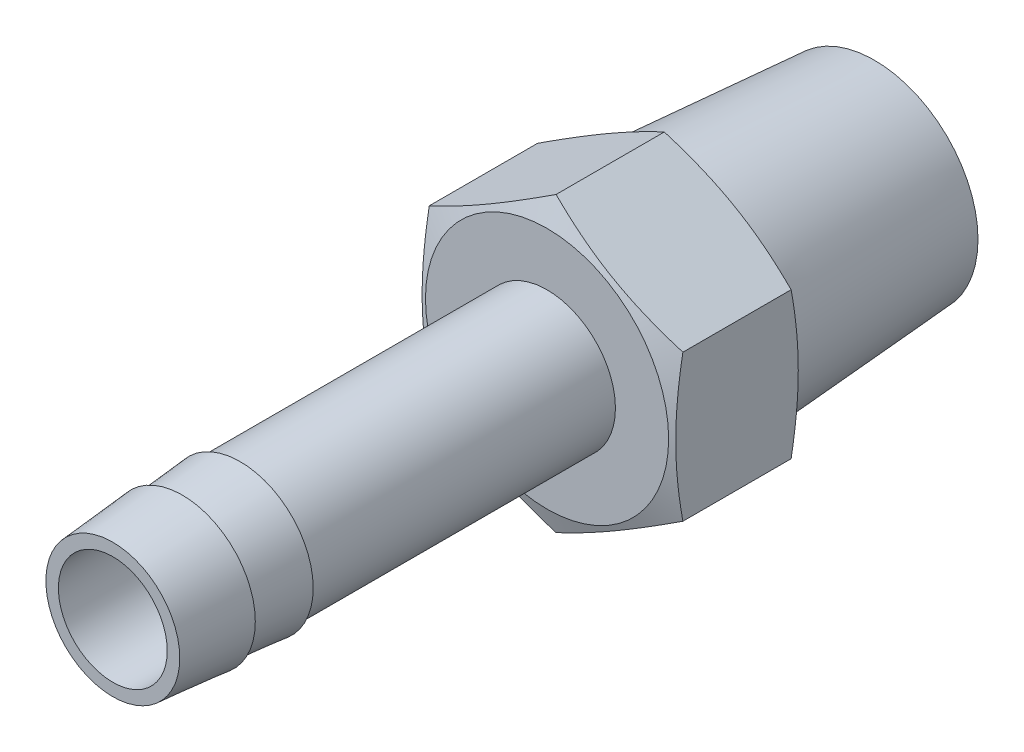
ISO-10303-21;
HEADER;
FILE_DESCRIPTION(('STEP AP214'),'2;1');
FILE_NAME('part.step','',(''),(''),'','','');
FILE_SCHEMA(('AUTOMOTIVE_DESIGN { 1 0 10303 214 1 1 1 1 }'));
ENDSEC;
DATA;
#1=APPLICATION_CONTEXT('core data for automotive mechanical design processes');
#2=APPLICATION_PROTOCOL_DEFINITION('international standard','automotive_design',2000,#1);
#3=PRODUCT_CONTEXT('',#1,'mechanical');
#4=PRODUCT('Part','Part','',(#3));
#5=PRODUCT_RELATED_PRODUCT_CATEGORY('part','',(#4));
#6=PRODUCT_DEFINITION_FORMATION('','',#4);
#7=PRODUCT_DEFINITION_CONTEXT('part definition',#1,'design');
#8=PRODUCT_DEFINITION('design','',#6,#7);
#9=PRODUCT_DEFINITION_SHAPE('','',#8);
#10=(LENGTH_UNIT() NAMED_UNIT(*) SI_UNIT(.MILLI.,.METRE.));
#11=(NAMED_UNIT(*) PLANE_ANGLE_UNIT() SI_UNIT($,.RADIAN.));
#12=(NAMED_UNIT(*) SI_UNIT($,.STERADIAN.) SOLID_ANGLE_UNIT());
#13=UNCERTAINTY_MEASURE_WITH_UNIT(LENGTH_MEASURE(1.E-05),#10,'distance_accuracy_value','');
#14=(GEOMETRIC_REPRESENTATION_CONTEXT(3) GLOBAL_UNCERTAINTY_ASSIGNED_CONTEXT((#13)) GLOBAL_UNIT_ASSIGNED_CONTEXT((#10,
#11,#12)) REPRESENTATION_CONTEXT('',''));
#15=CARTESIAN_POINT('',(0.,0.,0.));
#16=DIRECTION('',(0.,0.,1.));
#17=DIRECTION('',(1.,0.,0.));
#18=AXIS2_PLACEMENT_3D('',#15,#16,#17);
#19=CARTESIAN_POINT('',(0.,2.38759999999999,24.5911444918949));
#20=DIRECTION('',(0.,0.,-1.));
#21=DIRECTION('',(-1.,0.,0.));
#22=AXIS2_PLACEMENT_3D('',#19,#20,#21);
#23=PLANE('',#22);
#24=CARTESIAN_POINT('',(0.,0.,24.5911444918949));
#25=DIRECTION('',(0.,0.,1.));
#26=DIRECTION('',(1.,0.,0.));
#27=AXIS2_PLACEMENT_3D('',#24,#25,#26);
#28=CIRCLE('',#27,2.38759999999999);
#29=CARTESIAN_POINT('',(2.38759999999999,0.,24.5911444918949));
#30=VERTEX_POINT('',#29);
#31=EDGE_CURVE('E200',#30,#30,#28,.T.);
#32=ORIENTED_EDGE('',*,*,#31,.F.);
#33=EDGE_LOOP('',(#32));
#34=FACE_BOUND('',#33,.T.);
#35=CARTESIAN_POINT('',(0.,0.,24.5911444918949));
#36=DIRECTION('',(0.,0.,1.));
#37=DIRECTION('',(1.,0.,0.));
#38=AXIS2_PLACEMENT_3D('',#35,#36,#37);
#39=CIRCLE('',#38,2.93653455357301);
#40=CARTESIAN_POINT('',(2.93653455357301,0.,24.5911444918949));
#41=VERTEX_POINT('',#40);
#42=EDGE_CURVE('E238',#41,#41,#39,.T.);
#43=ORIENTED_EDGE('',*,*,#42,.T.);
#44=EDGE_LOOP('',(#43));
#45=FACE_BOUND('',#44,.T.);
#46=ADVANCED_FACE('F35',(#34,#45),#23,.F.);
#47=CARTESIAN_POINT('',(0.,0.,21.5431444918949));
#48=DIRECTION('',(0.,0.,-1.));
#49=DIRECTION('',(-1.,0.,0.));
#50=AXIS2_PLACEMENT_3D('',#47,#48,#49);
#51=CONICAL_SURFACE('',#50,3.2032,0.0872664625997091);
#52=ORIENTED_EDGE('',*,*,#42,.F.);
#53=EDGE_LOOP('',(#52));
#54=FACE_BOUND('',#53,.T.);
#55=CARTESIAN_POINT('',(0.,0.,21.5431444918949));
#56=DIRECTION('',(0.,0.,1.));
#57=DIRECTION('',(1.,0.,0.));
#58=AXIS2_PLACEMENT_3D('',#55,#56,#57);
#59=CIRCLE('',#58,3.2032);
#60=CARTESIAN_POINT('',(3.2032,0.,21.5431444918949));
#61=VERTEX_POINT('',#60);
#62=EDGE_CURVE('E236',#61,#61,#59,.T.);
#63=ORIENTED_EDGE('',*,*,#62,.T.);
#64=EDGE_LOOP('',(#63));
#65=FACE_BOUND('',#64,.T.);
#66=ADVANCED_FACE('F265',(#54,#65),#51,.T.);
#67=CARTESIAN_POINT('',(0.,0.,21.5238503382204));
#68=DIRECTION('',(0.,0.,1.));
#69=DIRECTION('',(1.,0.,0.));
#70=AXIS2_PLACEMENT_3D('',#67,#68,#69);
#71=CONICAL_SURFACE('',#70,2.98266681436302,1.48352986419519);
#72=ORIENTED_EDGE('',*,*,#62,.F.);
#73=EDGE_LOOP('',(#72));
#74=FACE_BOUND('',#73,.T.);
#75=CARTESIAN_POINT('',(0.,0.,21.5238503382204));
#76=DIRECTION('',(0.,0.,1.));
#77=DIRECTION('',(1.,0.,0.));
#78=AXIS2_PLACEMENT_3D('',#75,#76,#77);
#79=CIRCLE('',#78,2.98266681436302);
#80=CARTESIAN_POINT('',(2.98266681436302,0.,21.5238503382204));
#81=VERTEX_POINT('',#80);
#82=EDGE_CURVE('E233',#81,#81,#79,.T.);
#83=ORIENTED_EDGE('',*,*,#82,.T.);
#84=EDGE_LOOP('',(#83));
#85=FACE_BOUND('',#84,.T.);
#86=ADVANCED_FACE('F270',(#74,#85),#71,.T.);
#87=CARTESIAN_POINT('',(0.,0.,19.0031444918949));
#88=DIRECTION('',(0.,0.,-1.));
#89=DIRECTION('',(-1.,0.,0.));
#90=AXIS2_PLACEMENT_3D('',#87,#88,#89);
#91=CONICAL_SURFACE('',#90,3.2032,0.087266462599709);
#92=ORIENTED_EDGE('',*,*,#82,.F.);
#93=EDGE_LOOP('',(#92));
#94=FACE_BOUND('',#93,.T.);
#95=CARTESIAN_POINT('',(0.,0.,19.0031444918949));
#96=DIRECTION('',(0.,0.,1.));
#97=DIRECTION('',(1.,0.,0.));
#98=AXIS2_PLACEMENT_3D('',#95,#96,#97);
#99=CIRCLE('',#98,3.2032);
#100=CARTESIAN_POINT('',(3.2032,0.,19.0031444918949));
#101=VERTEX_POINT('',#100);
#102=EDGE_CURVE('E230',#101,#101,#99,.T.);
#103=ORIENTED_EDGE('',*,*,#102,.T.);
#104=EDGE_LOOP('',(#103));
#105=FACE_BOUND('',#104,.T.);
#106=ADVANCED_FACE('F344',(#94,#105),#91,.T.);
#107=CARTESIAN_POINT('',(0.,0.,18.9853667954665));
#108=DIRECTION('',(0.,0.,1.));
#109=DIRECTION('',(1.,0.,0.));
#110=AXIS2_PLACEMENT_3D('',#107,#108,#109);
#111=CONICAL_SURFACE('',#110,3.,1.48352986419518);
#112=ORIENTED_EDGE('',*,*,#102,.F.);
#113=EDGE_LOOP('',(#112));
#114=FACE_BOUND('',#113,.T.);
#115=CARTESIAN_POINT('',(0.,0.,18.9853667954665));
#116=DIRECTION('',(0.,0.,1.));
#117=DIRECTION('',(1.,0.,0.));
#118=AXIS2_PLACEMENT_3D('',#115,#116,#117);
#119=CIRCLE('',#118,3.);
#120=CARTESIAN_POINT('',(3.,0.,18.9853667954665));
#121=VERTEX_POINT('',#120);
#122=EDGE_CURVE('E227',#121,#121,#119,.T.);
#123=ORIENTED_EDGE('',*,*,#122,.T.);
#124=EDGE_LOOP('',(#123));
#125=FACE_BOUND('',#124,.T.);
#126=ADVANCED_FACE('F336',(#114,#125),#111,.T.);
#127=CARTESIAN_POINT('',(0.,0.,-2.00199408661353));
#128=DIRECTION('',(0.,0.,1.));
#129=DIRECTION('',(1.,0.,0.));
#130=AXIS2_PLACEMENT_3D('',#127,#128,#129);
#131=CYLINDRICAL_SURFACE('',#130,3.);
#132=ORIENTED_EDGE('',*,*,#122,.F.);
#133=EDGE_LOOP('',(#132));
#134=FACE_BOUND('',#133,.T.);
#135=CARTESIAN_POINT('',(0.,0.,5.54114449189492));
#136=DIRECTION('',(0.,0.,1.));
#137=DIRECTION('',(1.,0.,0.));
#138=AXIS2_PLACEMENT_3D('',#135,#136,#137);
#139=CIRCLE('',#138,3.);
#140=CARTESIAN_POINT('',(3.,0.,5.54114449189492));
#141=VERTEX_POINT('',#140);
#142=EDGE_CURVE('E224',#141,#141,#139,.T.);
#143=ORIENTED_EDGE('',*,*,#142,.T.);
#144=EDGE_LOOP('',(#143));
#145=FACE_BOUND('',#144,.T.);
#146=ADVANCED_FACE('F329',(#134,#145),#131,.T.);
#147=CARTESIAN_POINT('',(0.,3.,5.54114449189492));
#148=DIRECTION('',(0.,0.,-1.));
#149=DIRECTION('',(-1.,0.,0.));
#150=AXIS2_PLACEMENT_3D('',#147,#148,#149);
#151=PLANE('',#150);
#152=ORIENTED_EDGE('',*,*,#142,.F.);
#153=EDGE_LOOP('',(#152));
#154=FACE_BOUND('',#153,.T.);
#155=CARTESIAN_POINT('',(0.,0.,5.54114449189492));
#156=DIRECTION('',(0.,0.,1.));
#157=DIRECTION('',(1.,0.,0.));
#158=AXIS2_PLACEMENT_3D('',#155,#156,#157);
#159=CIRCLE('',#158,5.334);
#160=CARTESIAN_POINT('',(5.334,0.,5.54114449189492));
#161=VERTEX_POINT('',#160);
#162=EDGE_CURVE('E221',#161,#161,#159,.T.);
#163=ORIENTED_EDGE('',*,*,#162,.T.);
#164=EDGE_LOOP('',(#163));
#165=FACE_BOUND('',#164,.T.);
#166=ADVANCED_FACE('F324',(#154,#165),#151,.F.);
#167=CARTESIAN_POINT('',(0.,0.,4.61666009685876));
#168=DIRECTION('',(0.,0.,-1.));
#169=DIRECTION('',(-1.,0.,0.));
#170=AXIS2_PLACEMENT_3D('',#167,#168,#169);
#171=CONICAL_SURFACE('',#170,7.874,1.22173047639603);
#172=CARTESIAN_POINT('',(5.5626,-8.54554870564613,3.7713337094074));
#173=CARTESIAN_POINT('',(5.5626,-8.29339506949219,3.84822885143271));
#174=CARTESIAN_POINT('',(5.5626,-8.04096563886859,3.92423595562298));
#175=CARTESIAN_POINT('',(5.5626,-7.53541465199099,4.07398285346704));
#176=CARTESIAN_POINT('',(5.5626,-7.28229304355041,4.14772247072788));
#177=CARTESIAN_POINT('',(5.5626,-6.77479502650072,4.29256270807403));
#178=CARTESIAN_POINT('',(5.5626,-6.52041717281995,4.36365828288699));
#179=CARTESIAN_POINT('',(5.5626,-6.0107209725132,4.50238934497568));
#180=CARTESIAN_POINT('',(5.5626,-5.75540264258231,4.5700248933586));
#181=CARTESIAN_POINT('',(5.5626,-5.24681855741219,4.70016873630074));
#182=CARTESIAN_POINT('',(5.5626,-4.99356644295143,4.7627300757038));
#183=CARTESIAN_POINT('',(5.5626,-4.48580694775765,4.88259024242452));
#184=CARTESIAN_POINT('',(5.5626,-4.23129954611418,4.93988898176422));
#185=CARTESIAN_POINT('',(5.5626,-3.72096337830154,5.04790244048548));
#186=CARTESIAN_POINT('',(5.5626,-3.46513505382622,5.09861922907826));
#187=CARTESIAN_POINT('',(5.5626,-2.95199123636959,5.19193621515578));
#188=CARTESIAN_POINT('',(5.5626,-2.69467579244848,5.23453667884172));
#189=CARTESIAN_POINT('',(5.5626,-2.20743496300476,5.30568970790488));
#190=CARTESIAN_POINT('',(5.5626,-1.97766257417543,5.33528019843593));
#191=CARTESIAN_POINT('',(5.5626,-1.51713343009414,5.38551216428207));
#192=CARTESIAN_POINT('',(5.5626,-1.28637670358041,5.40615389907907));
#193=CARTESIAN_POINT('',(5.5626,-0.824348395478607,5.43749501074389));
#194=CARTESIAN_POINT('',(5.5626,-0.593077316705621,5.44820168103005));
#195=CARTESIAN_POINT('',(5.5626,-0.130284989650247,5.45912980852409));
#196=CARTESIAN_POINT('',(5.5626,0.101236256624774,5.4593513492499));
#197=CARTESIAN_POINT('',(5.5626,0.565242562726057,5.44927088662767));
#198=CARTESIAN_POINT('',(5.5626,0.797726421509263,5.43891450266108));
#199=CARTESIAN_POINT('',(5.5626,1.26202261723753,5.40815247515708));
#200=CARTESIAN_POINT('',(5.5626,1.49383493771312,5.38774658721969));
#201=CARTESIAN_POINT('',(5.5626,1.95667118162347,5.33784901388525));
#202=CARTESIAN_POINT('',(5.5626,2.18769423444998,5.30834936919579));
#203=CARTESIAN_POINT('',(5.5626,2.64858402276262,5.24147364309617));
#204=CARTESIAN_POINT('',(5.5626,2.87845075352467,5.20409752953392));
#205=CARTESIAN_POINT('',(5.5626,3.35461676896683,5.1195710099851));
#206=CARTESIAN_POINT('',(5.5626,3.6008210712496,5.07189013696224));
#207=CARTESIAN_POINT('',(5.5626,4.09193389098685,4.9702273776282));
#208=CARTESIAN_POINT('',(5.5626,4.33684230087718,4.91624497658275));
#209=CARTESIAN_POINT('',(5.5626,4.82554925856572,4.8031658262339));
#210=CARTESIAN_POINT('',(5.5626,5.06934743272381,4.74406747234213));
#211=CARTESIAN_POINT('',(5.5626,5.55589743714807,4.62175625099128));
#212=CARTESIAN_POINT('',(5.5626,5.79864929457522,4.55854349103088));
#213=CARTESIAN_POINT('',(5.5626,6.28359150607403,4.42870133671378));
#214=CARTESIAN_POINT('',(5.5626,6.52578063157035,4.3620673704488));
#215=CARTESIAN_POINT('',(5.5626,7.00939640962966,4.22608263219788));
#216=CARTESIAN_POINT('',(5.5626,7.25082305061213,4.15673181916116));
#217=CARTESIAN_POINT('',(5.5626,7.97404202926178,3.94540007549008));
#218=CARTESIAN_POINT('',(5.5626,8.45486787468237,3.80011410512942));
#219=CARTESIAN_POINT('',(5.5626,9.4092108519072,3.50522685652038));
#220=CARTESIAN_POINT('',(5.5626,9.88274904392028,3.35569317268865));
#221=CARTESIAN_POINT('',(5.5626,10.8285083809554,3.05244238620377));
#222=CARTESIAN_POINT('',(5.5626,11.3007294564966,2.89872506729009));
#223=CARTESIAN_POINT('',(5.5626,12.2422933940534,2.58887625008539));
#224=CARTESIAN_POINT('',(5.5626,12.7116402311509,2.43275679532578));
#225=CARTESIAN_POINT('',(5.5626,13.6495230159554,2.11823113499853));
#226=CARTESIAN_POINT('',(5.5626,14.1180590296251,1.95982512628801));
#227=CARTESIAN_POINT('',(5.5626,14.5863207253582,1.8006229764812));
#228=B_SPLINE_CURVE_WITH_KNOTS('',3,(#172,#173,#174,#175,#176,#177,#178,#179,#180,#181,#182,
#183,#184,#185,#186,#187,#188,#189,#190,#191,#192,#193,#194,#195,#196,#197,#198,#199,#200,#201,
#202,#203,#204,#205,#206,#207,#208,#209,#210,#211,#212,#213,#214,#215,#216,#217,#218,#219,#220,
#221,#222,#223,#224,#225,#226,#227),.UNSPECIFIED.,.F.,.F.,(4,2,2,2,2,2,2,2,2,2,2,2,2,2,2,2,2,2,
2,2,2,2,2,2,2,2,2,4),(0.,0.79085875995942,1.58177888776594,2.37413795765285,3.16648302892869,
3.94903365056431,4.73159735217397,5.51391443502171,6.29620585482319,6.99106414909324,
7.6859022936102,8.38022994684806,9.07455206950842,9.77246172500104,10.4703883542208,
11.1689275850937,11.8674696674894,12.6197039139892,13.3719996490746,14.1245321981415,
14.8770450933834,15.630591196592,16.3841486900625,17.890970042694,19.380708855008,
20.8705248217333,22.3544112579752,23.8381706945014),.UNSPECIFIED.);
#229=CARTESIAN_POINT('',(5.5626,-3.21156860739422,5.14473096468033));
#230=VERTEX_POINT('',#229);
#231=CARTESIAN_POINT('',(5.5626,3.21156860739422,5.14473096468033));
#232=VERTEX_POINT('',#231);
#233=EDGE_CURVE('E89',#230,#232,#228,.T.);
#234=ORIENTED_EDGE('',*,*,#233,.T.);
#235=CARTESIAN_POINT('',(5.5628,3.21145313734038,5.1446889358845));
#236=CARTESIAN_POINT('',(5.33242403290079,3.34446076395993,5.19311827635646));
#237=CARTESIAN_POINT('',(5.1012883757334,3.47790699784484,5.23717317518359));
#238=CARTESIAN_POINT('',(4.63751416451068,3.74566716353748,5.31468099291214));
#239=CARTESIAN_POINT('',(4.40487457880276,3.87998169097011,5.34812561531736));
#240=CARTESIAN_POINT('',(3.94067432787475,4.14798783080129,5.40222134807434));
#241=CARTESIAN_POINT('',(3.70912426435467,4.28167332230549,5.42299045176448));
#242=CARTESIAN_POINT('',(3.24548264337888,4.54935693698337,5.45084766079256));
#243=CARTESIAN_POINT('',(3.01339132168944,4.68335492403734,5.45794089634166));
#244=CARTESIAN_POINT('',(2.54920867831056,4.9513508981453,5.45794089634166));
#245=CARTESIAN_POINT('',(2.31711735662112,5.08534888519927,5.45084766079256));
#246=CARTESIAN_POINT('',(1.85347573564533,5.35303249987715,5.42299045176448));
#247=CARTESIAN_POINT('',(1.62192567212525,5.48671799138135,5.40222134807434));
#248=CARTESIAN_POINT('',(1.15772542119724,5.75472413121253,5.34812561531736));
#249=CARTESIAN_POINT('',(0.925085835489321,5.88903865864516,5.31468099291214));
#250=CARTESIAN_POINT('',(0.461311624266595,6.1567988243378,5.23717317518359));
#251=CARTESIAN_POINT('',(0.230175967099212,6.29024505822271,5.19311827635646));
#252=CARTESIAN_POINT('',(-0.000199999999997733,6.42325268484226,5.1446889358845));
#253=B_SPLINE_CURVE_WITH_KNOTS('',3,(#235,#236,#237,#238,#239,#240,#241,#242,#243,#244,#245,
#246,#247,#248,#249,#250,#251,#252),.UNSPECIFIED.,.F.,.F.,(4,2,2,2,2,2,2,2,4),(0.,
0.811246819546949,1.62312642293092,2.42732833395453,3.23122850698775,4.03512868002098,
4.83933059104459,5.65121019442856,6.46245701397551),.UNSPECIFIED.);
#254=CARTESIAN_POINT('',(0.,6.42313721478843,5.14473096468033));
#255=VERTEX_POINT('',#254);
#256=EDGE_CURVE('E192',#232,#255,#253,.T.);
#257=ORIENTED_EDGE('',*,*,#256,.T.);
#258=CARTESIAN_POINT('',(0.000199999999999985,6.42325268484226,5.1446889358845));
#259=CARTESIAN_POINT('',(-0.230175967099209,6.29024505822271,5.19311827635646));
#260=CARTESIAN_POINT('',(-0.461311624266594,6.1567988243378,5.23717317518359));
#261=CARTESIAN_POINT('',(-0.925085835489321,5.88903865864516,5.31468099291214));
#262=CARTESIAN_POINT('',(-1.15772542119724,5.75472413121253,5.34812561531735));
#263=CARTESIAN_POINT('',(-1.62192567212525,5.48671799138135,5.40222134807434));
#264=CARTESIAN_POINT('',(-1.85347573564533,5.35303249987716,5.42299045176448));
#265=CARTESIAN_POINT('',(-2.31711735662112,5.08534888519927,5.45084766079256));
#266=CARTESIAN_POINT('',(-2.54920867831056,4.9513508981453,5.45794089634166));
#267=CARTESIAN_POINT('',(-3.01339132168944,4.68335492403734,5.45794089634166));
#268=CARTESIAN_POINT('',(-3.24548264337888,4.54935693698337,5.45084766079256));
#269=CARTESIAN_POINT('',(-3.70912426435467,4.28167332230549,5.42299045176448));
#270=CARTESIAN_POINT('',(-3.94067432787475,4.14798783080129,5.40222134807434));
#271=CARTESIAN_POINT('',(-4.40487457880276,3.87998169097011,5.34812561531735));
#272=CARTESIAN_POINT('',(-4.63751416451068,3.74566716353748,5.31468099291214));
#273=CARTESIAN_POINT('',(-5.10128837573341,3.47790699784483,5.23717317518359));
#274=CARTESIAN_POINT('',(-5.33242403290079,3.34446076395992,5.19311827635646));
#275=CARTESIAN_POINT('',(-5.5628,3.21145313734038,5.1446889358845));
#276=B_SPLINE_CURVE_WITH_KNOTS('',3,(#258,#259,#260,#261,#262,#263,#264,#265,#266,#267,#268,
#269,#270,#271,#272,#273,#274,#275),.UNSPECIFIED.,.F.,.F.,(4,2,2,2,2,2,2,2,4),(0.,
0.81124681954695,1.62312642293092,2.42732833395453,3.23122850698776,4.03512868002098,
4.8393305910446,5.65121019442857,6.46245701397551),.UNSPECIFIED.);
#277=CARTESIAN_POINT('',(-5.5626,3.21156860739421,5.14473096468033));
#278=VERTEX_POINT('',#277);
#279=EDGE_CURVE('E186',#255,#278,#276,.T.);
#280=ORIENTED_EDGE('',*,*,#279,.T.);
#281=CARTESIAN_POINT('',(-5.5626,-8.54554870564613,3.7713337094074));
#282=CARTESIAN_POINT('',(-5.5626,-8.29339506949219,3.84822885143271));
#283=CARTESIAN_POINT('',(-5.5626,-8.04096563886859,3.92423595562298));
#284=CARTESIAN_POINT('',(-5.5626,-7.53541465199099,4.07398285346704));
#285=CARTESIAN_POINT('',(-5.5626,-7.28229304355041,4.14772247072788));
#286=CARTESIAN_POINT('',(-5.5626,-6.77479502650072,4.29256270807403));
#287=CARTESIAN_POINT('',(-5.5626,-6.52041717281995,4.36365828288699));
#288=CARTESIAN_POINT('',(-5.5626,-6.0107209725132,4.50238934497568));
#289=CARTESIAN_POINT('',(-5.5626,-5.7554026425823,4.5700248933586));
#290=CARTESIAN_POINT('',(-5.5626,-5.24681855741218,4.70016873630073));
#291=CARTESIAN_POINT('',(-5.5626,-4.99356644295143,4.7627300757038));
#292=CARTESIAN_POINT('',(-5.5626,-4.48580694775765,4.88259024242452));
#293=CARTESIAN_POINT('',(-5.5626,-4.23129954611418,4.93988898176422));
#294=CARTESIAN_POINT('',(-5.5626,-3.72096337830153,5.04790244048548));
#295=CARTESIAN_POINT('',(-5.5626,-3.46513505382622,5.09861922907826));
#296=CARTESIAN_POINT('',(-5.5626,-2.95199123636958,5.19193621515577));
#297=CARTESIAN_POINT('',(-5.5626,-2.69467579244848,5.23453667884172));
#298=CARTESIAN_POINT('',(-5.5626,-2.20743496300476,5.30568970790488));
#299=CARTESIAN_POINT('',(-5.5626,-1.97766257417543,5.33528019843593));
#300=CARTESIAN_POINT('',(-5.5626,-1.51713343009414,5.38551216428207));
#301=CARTESIAN_POINT('',(-5.5626,-1.28637670358041,5.40615389907907));
#302=CARTESIAN_POINT('',(-5.5626,-0.824348395478605,5.43749501074389));
#303=CARTESIAN_POINT('',(-5.5626,-0.593077316705619,5.44820168103005));
#304=CARTESIAN_POINT('',(-5.5626,-0.130284989650245,5.45912980852409));
#305=CARTESIAN_POINT('',(-5.5626,0.101236256624776,5.4593513492499));
#306=CARTESIAN_POINT('',(-5.5626,0.565242562726061,5.44927088662767));
#307=CARTESIAN_POINT('',(-5.5626,0.797726421509267,5.43891450266108));
#308=CARTESIAN_POINT('',(-5.5626,1.26202261723753,5.40815247515708));
#309=CARTESIAN_POINT('',(-5.5626,1.49383493771312,5.38774658721968));
#310=CARTESIAN_POINT('',(-5.5626,1.95667118162347,5.33784901388525));
#311=CARTESIAN_POINT('',(-5.5626,2.18769423444998,5.30834936919579));
#312=CARTESIAN_POINT('',(-5.5626,2.64858402276262,5.24147364309617));
#313=CARTESIAN_POINT('',(-5.5626,2.87845075352468,5.20409752953392));
#314=CARTESIAN_POINT('',(-5.5626,3.35461676896684,5.1195710099851));
#315=CARTESIAN_POINT('',(-5.5626,3.6008210712496,5.07189013696224));
#316=CARTESIAN_POINT('',(-5.5626,4.09193389098685,4.9702273776282));
#317=CARTESIAN_POINT('',(-5.5626,4.33684230087718,4.91624497658275));
#318=CARTESIAN_POINT('',(-5.5626,4.82554925856573,4.8031658262339));
#319=CARTESIAN_POINT('',(-5.5626,5.06934743272381,4.74406747234213));
#320=CARTESIAN_POINT('',(-5.5626,5.55589743714807,4.62175625099128));
#321=CARTESIAN_POINT('',(-5.5626,5.79864929457522,4.55854349103088));
#322=CARTESIAN_POINT('',(-5.5626,6.28359150607403,4.42870133671378));
#323=CARTESIAN_POINT('',(-5.5626,6.52578063157034,4.3620673704488));
#324=CARTESIAN_POINT('',(-5.5626,7.00939640962966,4.22608263219788));
#325=CARTESIAN_POINT('',(-5.5626,7.25082305061213,4.15673181916116));
#326=CARTESIAN_POINT('',(-5.5626,7.97404202926178,3.94540007549008));
#327=CARTESIAN_POINT('',(-5.5626,8.45486787468237,3.80011410512941));
#328=CARTESIAN_POINT('',(-5.5626,9.4092108519072,3.50522685652038));
#329=CARTESIAN_POINT('',(-5.5626,9.88274904392028,3.35569317268865));
#330=CARTESIAN_POINT('',(-5.5626,10.8285083809554,3.05244238620377));
#331=CARTESIAN_POINT('',(-5.5626,11.3007294564966,2.89872506729009));
#332=CARTESIAN_POINT('',(-5.5626,12.2422933940534,2.58887625008539));
#333=CARTESIAN_POINT('',(-5.5626,12.7116402311509,2.43275679532578));
#334=CARTESIAN_POINT('',(-5.5626,13.6495230159554,2.11823113499853));
#335=CARTESIAN_POINT('',(-5.5626,14.1180590296251,1.95982512628801));
#336=CARTESIAN_POINT('',(-5.5626,14.5863207253582,1.8006229764812));
#337=B_SPLINE_CURVE_WITH_KNOTS('',3,(#281,#282,#283,#284,#285,#286,#287,#288,#289,#290,#291,
#292,#293,#294,#295,#296,#297,#298,#299,#300,#301,#302,#303,#304,#305,#306,#307,#308,#309,#310,
#311,#312,#313,#314,#315,#316,#317,#318,#319,#320,#321,#322,#323,#324,#325,#326,#327,#328,#329,
#330,#331,#332,#333,#334,#335,#336),.UNSPECIFIED.,.F.,.F.,(4,2,2,2,2,2,2,2,2,2,2,2,2,2,2,2,2,2,
2,2,2,2,2,2,2,2,2,4),(0.,0.790858759959419,1.58177888776594,2.37413795765284,3.16648302892869,
3.94903365056431,4.73159735217397,5.51391443502171,6.29620585482319,6.99106414909324,
7.6859022936102,8.38022994684806,9.07455206950842,9.77246172500104,10.4703883542208,
11.1689275850937,11.8674696674894,12.6197039139892,13.3719996490746,14.1245321981415,
14.8770450933834,15.630591196592,16.3841486900625,17.890970042694,19.3807088550079,
20.8705248217333,22.3544112579752,23.8381706945014),.UNSPECIFIED.);
#338=CARTESIAN_POINT('',(-5.5626,-3.21156860739421,5.14473096468033));
#339=VERTEX_POINT('',#338);
#340=EDGE_CURVE('E112',#278,#339,#337,.F.);
#341=ORIENTED_EDGE('',*,*,#340,.T.);
#342=CARTESIAN_POINT('',(-5.5628,-3.21145313734037,5.1446889358845));
#343=CARTESIAN_POINT('',(-5.33242403290079,-3.34446076395992,5.19311827635646));
#344=CARTESIAN_POINT('',(-5.10128837573341,-3.47790699784483,5.23717317518359));
#345=CARTESIAN_POINT('',(-4.63751416451068,-3.74566716353748,5.31468099291214));
#346=CARTESIAN_POINT('',(-4.40487457880276,-3.87998169097011,5.34812561531736));
#347=CARTESIAN_POINT('',(-3.94067432787475,-4.14798783080129,5.40222134807434));
#348=CARTESIAN_POINT('',(-3.70912426435467,-4.28167332230548,5.42299045176448));
#349=CARTESIAN_POINT('',(-3.24548264337888,-4.54935693698337,5.45084766079256));
#350=CARTESIAN_POINT('',(-3.01339132168944,-4.68335492403734,5.45794089634166));
#351=CARTESIAN_POINT('',(-2.54920867831056,-4.95135089814529,5.45794089634166));
#352=CARTESIAN_POINT('',(-2.31711735662112,-5.08534888519927,5.45084766079256));
#353=CARTESIAN_POINT('',(-1.85347573564533,-5.35303249987716,5.42299045176448));
#354=CARTESIAN_POINT('',(-1.62192567212525,-5.48671799138135,5.40222134807434));
#355=CARTESIAN_POINT('',(-1.15772542119724,-5.75472413121253,5.34812561531735));
#356=CARTESIAN_POINT('',(-0.92508583548932,-5.88903865864516,5.31468099291214));
#357=CARTESIAN_POINT('',(-0.461311624266593,-6.1567988243378,5.23717317518359));
#358=CARTESIAN_POINT('',(-0.230175967099208,-6.29024505822271,5.19311827635646));
#359=CARTESIAN_POINT('',(0.000200000000000923,-6.42325268484226,5.1446889358845));
#360=B_SPLINE_CURVE_WITH_KNOTS('',3,(#342,#343,#344,#345,#346,#347,#348,#349,#350,#351,#352,
#353,#354,#355,#356,#357,#358,#359),.UNSPECIFIED.,.F.,.F.,(4,2,2,2,2,2,2,2,4),(0.,
0.81124681954695,1.62312642293092,2.42732833395453,3.23122850698776,4.03512868002099,
4.8393305910446,5.65121019442857,6.46245701397552),.UNSPECIFIED.);
#361=CARTESIAN_POINT('',(0.,-6.42313721478843,5.14473096468033));
#362=VERTEX_POINT('',#361);
#363=EDGE_CURVE('E110',#339,#362,#360,.T.);
#364=ORIENTED_EDGE('',*,*,#363,.T.);
#365=CARTESIAN_POINT('',(-0.000200000000001228,-6.42325268484226,5.1446889358845));
#366=CARTESIAN_POINT('',(0.230175967099208,-6.29024505822271,5.19311827635646));
#367=CARTESIAN_POINT('',(0.461311624266592,-6.1567988243378,5.23717317518359));
#368=CARTESIAN_POINT('',(0.925085835489319,-5.88903865864516,5.31468099291214));
#369=CARTESIAN_POINT('',(1.15772542119724,-5.75472413121253,5.34812561531735));
#370=CARTESIAN_POINT('',(1.62192567212525,-5.48671799138135,5.40222134807434));
#371=CARTESIAN_POINT('',(1.85347573564533,-5.35303249987716,5.42299045176448));
#372=CARTESIAN_POINT('',(2.31711735662111,-5.08534888519927,5.45084766079256));
#373=CARTESIAN_POINT('',(2.54920867831056,-4.9513508981453,5.45794089634166));
#374=CARTESIAN_POINT('',(3.01339132168944,-4.68335492403735,5.45794089634166));
#375=CARTESIAN_POINT('',(3.24548264337888,-4.54935693698337,5.45084766079256));
#376=CARTESIAN_POINT('',(3.70912426435467,-4.28167332230549,5.42299045176448));
#377=CARTESIAN_POINT('',(3.94067432787474,-4.14798783080129,5.40222134807434));
#378=CARTESIAN_POINT('',(4.40487457880276,-3.87998169097011,5.34812561531736));
#379=CARTESIAN_POINT('',(4.63751416451068,-3.74566716353748,5.31468099291214));
#380=CARTESIAN_POINT('',(5.1012883757334,-3.47790699784484,5.23717317518359));
#381=CARTESIAN_POINT('',(5.33242403290079,-3.34446076395993,5.19311827635646));
#382=CARTESIAN_POINT('',(5.5628,-3.21145313734038,5.1446889358845));
#383=B_SPLINE_CURVE_WITH_KNOTS('',3,(#365,#366,#367,#368,#369,#370,#371,#372,#373,#374,#375,
#376,#377,#378,#379,#380,#381,#382),.UNSPECIFIED.,.F.,.F.,(4,2,2,2,2,2,2,2,4),(0.,
0.81124681954695,1.62312642293092,2.42732833395453,3.23122850698776,4.03512868002098,
4.8393305910446,5.65121019442856,6.46245701397551),.UNSPECIFIED.);
#384=EDGE_CURVE('E94',#362,#230,#383,.T.);
#385=ORIENTED_EDGE('',*,*,#384,.T.);
#386=EDGE_LOOP('',(#234,#257,#280,#341,#364,#385));
#387=FACE_BOUND('',#386,.T.);
#388=ORIENTED_EDGE('',*,*,#162,.F.);
#389=EDGE_LOOP('',(#388));
#390=FACE_BOUND('',#389,.T.);
#391=ADVANCED_FACE('F107',(#387,#390),#171,.T.);
#392=CARTESIAN_POINT('',(0.,0.,0.));
#393=DIRECTION('',(0.,0.,1.));
#394=DIRECTION('',(1.,0.,0.));
#395=AXIS2_PLACEMENT_3D('',#392,#393,#394);
#396=CONICAL_SURFACE('',#395,5.334,1.22173047639603);
#397=CARTESIAN_POINT('',(-5.5628,3.21145313734038,0.396455556010419));
#398=CARTESIAN_POINT('',(-5.33242403290079,3.34446076395993,0.348026215538452));
#399=CARTESIAN_POINT('',(-5.10128837573341,3.47790699784484,0.303971316711324));
#400=CARTESIAN_POINT('',(-4.63751416451068,3.74566716353748,0.226463498982773));
#401=CARTESIAN_POINT('',(-4.40487457880276,3.87998169097011,0.19301887657756));
#402=CARTESIAN_POINT('',(-3.94067432787475,4.14798783080129,0.138923143820578));
#403=CARTESIAN_POINT('',(-3.70912426435467,4.28167332230549,0.118154040130432));
#404=CARTESIAN_POINT('',(-3.24548264337888,4.54935693698337,0.0902968311023536));
#405=CARTESIAN_POINT('',(-3.01339132168944,4.68335492403734,0.0832035955532546));
#406=CARTESIAN_POINT('',(-2.54920867831056,4.9513508981453,0.0832035955532547));
#407=CARTESIAN_POINT('',(-2.31711735662112,5.08534888519927,0.0902968311023538));
#408=CARTESIAN_POINT('',(-1.85347573564533,5.35303249987716,0.118154040130432));
#409=CARTESIAN_POINT('',(-1.62192567212525,5.48671799138135,0.138923143820577));
#410=CARTESIAN_POINT('',(-1.15772542119724,5.75472413121253,0.19301887657756));
#411=CARTESIAN_POINT('',(-0.92508583548932,5.88903865864516,0.226463498982773));
#412=CARTESIAN_POINT('',(-0.461311624266593,6.15679882433781,0.303971316711324));
#413=CARTESIAN_POINT('',(-0.230175967099208,6.29024505822272,0.348026215538452));
#414=CARTESIAN_POINT('',(0.000200000000000917,6.42325268484226,0.39645555601042));
#415=B_SPLINE_CURVE_WITH_KNOTS('',3,(#397,#398,#399,#400,#401,#402,#403,#404,#405,#406,#407,
#408,#409,#410,#411,#412,#413,#414),.UNSPECIFIED.,.F.,.F.,(4,2,2,2,2,2,2,2,4),(0.,
0.81124681954695,1.62312642293092,2.42732833395453,3.23122850698776,4.03512868002098,
4.8393305910446,5.65121019442856,6.46245701397551),.UNSPECIFIED.);
#416=CARTESIAN_POINT('',(-5.5626,3.21156860739421,0.396413527214584));
#417=VERTEX_POINT('',#416);
#418=CARTESIAN_POINT('',(0.,6.42313721478843,0.396413527214584));
#419=VERTEX_POINT('',#418);
#420=EDGE_CURVE('E47',#417,#419,#415,.T.);
#421=ORIENTED_EDGE('',*,*,#420,.T.);
#422=CARTESIAN_POINT('',(-0.000199999999999829,6.42325268484226,0.396455556010419));
#423=CARTESIAN_POINT('',(0.23017596709921,6.29024505822271,0.348026215538452));
#424=CARTESIAN_POINT('',(0.461311624266593,6.1567988243378,0.303971316711324));
#425=CARTESIAN_POINT('',(0.92508583548932,5.88903865864516,0.226463498982773));
#426=CARTESIAN_POINT('',(1.15772542119724,5.75472413121253,0.19301887657756));
#427=CARTESIAN_POINT('',(1.62192567212525,5.48671799138135,0.138923143820577));
#428=CARTESIAN_POINT('',(1.85347573564533,5.35303249987716,0.118154040130432));
#429=CARTESIAN_POINT('',(2.31711735662112,5.08534888519927,0.0902968311023536));
#430=CARTESIAN_POINT('',(2.54920867831056,4.9513508981453,0.0832035955532546));
#431=CARTESIAN_POINT('',(3.01339132168944,4.68335492403735,0.0832035955532545));
#432=CARTESIAN_POINT('',(3.24548264337888,4.54935693698337,0.0902968311023535));
#433=CARTESIAN_POINT('',(3.70912426435467,4.28167332230549,0.118154040130431));
#434=CARTESIAN_POINT('',(3.94067432787474,4.14798783080129,0.138923143820577));
#435=CARTESIAN_POINT('',(4.40487457880276,3.87998169097011,0.193018876577559));
#436=CARTESIAN_POINT('',(4.63751416451068,3.74566716353748,0.226463498982772));
#437=CARTESIAN_POINT('',(5.1012883757334,3.47790699784484,0.303971316711323));
#438=CARTESIAN_POINT('',(5.33242403290079,3.34446076395993,0.348026215538451));
#439=CARTESIAN_POINT('',(5.5628,3.21145313734038,0.396455556010418));
#440=B_SPLINE_CURVE_WITH_KNOTS('',3,(#422,#423,#424,#425,#426,#427,#428,#429,#430,#431,#432,
#433,#434,#435,#436,#437,#438,#439),.UNSPECIFIED.,.F.,.F.,(4,2,2,2,2,2,2,2,4),(0.,
0.811246819546949,1.62312642293092,2.42732833395453,3.23122850698775,4.03512868002098,
4.83933059104459,5.65121019442856,6.46245701397551),.UNSPECIFIED.);
#441=CARTESIAN_POINT('',(5.5626,3.21156860739422,0.396413527214583));
#442=VERTEX_POINT('',#441);
#443=EDGE_CURVE('E12',#419,#442,#440,.T.);
#444=ORIENTED_EDGE('',*,*,#443,.T.);
#445=CARTESIAN_POINT('',(5.5626,-8.54554870564614,1.76981078248751));
#446=CARTESIAN_POINT('',(5.5626,-8.29339506949219,1.69291564046221));
#447=CARTESIAN_POINT('',(5.5626,-8.04096563886859,1.61690853627194));
#448=CARTESIAN_POINT('',(5.5626,-7.53541465199099,1.46716163842788));
#449=CARTESIAN_POINT('',(5.5626,-7.28229304355041,1.39342202116704));
#450=CARTESIAN_POINT('',(5.5626,-6.77479502650072,1.24858178382089));
#451=CARTESIAN_POINT('',(5.5626,-6.52041717281995,1.17748620900793));
#452=CARTESIAN_POINT('',(5.5626,-6.0107209725132,1.03875514691924));
#453=CARTESIAN_POINT('',(5.5626,-5.75540264258231,0.971119598536314));
#454=CARTESIAN_POINT('',(5.5626,-5.24681855741219,0.84097575559418));
#455=CARTESIAN_POINT('',(5.5626,-4.99356644295143,0.778414416191112));
#456=CARTESIAN_POINT('',(5.5626,-4.48580694775765,0.658554249470393));
#457=CARTESIAN_POINT('',(5.5626,-4.23129954611418,0.601255510130692));
#458=CARTESIAN_POINT('',(5.5626,-3.72096337830154,0.493242051409434));
#459=CARTESIAN_POINT('',(5.5626,-3.46513505382622,0.442525262816652));
#460=CARTESIAN_POINT('',(5.5626,-2.95199123636959,0.34920827673914));
#461=CARTESIAN_POINT('',(5.5626,-2.69467579244848,0.306607813053197));
#462=CARTESIAN_POINT('',(5.5626,-2.20743496300476,0.235454783990039));
#463=CARTESIAN_POINT('',(5.5626,-1.97766257417543,0.205864293458984));
#464=CARTESIAN_POINT('',(5.5626,-1.51713343009414,0.155632327612842));
#465=CARTESIAN_POINT('',(5.5626,-1.28637670358041,0.134990592815846));
#466=CARTESIAN_POINT('',(5.5626,-0.824348395478609,0.103649481151026));
#467=CARTESIAN_POINT('',(5.5626,-0.593077316705623,0.0929428108648638));
#468=CARTESIAN_POINT('',(5.5626,-0.13028498965025,0.0820146833708237));
#469=CARTESIAN_POINT('',(5.5626,0.101236256624772,0.0817931426450104));
#470=CARTESIAN_POINT('',(5.5626,0.565242562726056,0.0918736052672483));
#471=CARTESIAN_POINT('',(5.5626,0.797726421509262,0.102229989233838));
#472=CARTESIAN_POINT('',(5.5626,1.26202261723753,0.132992016737833));
#473=CARTESIAN_POINT('',(5.5626,1.49383493771312,0.153397904675231));
#474=CARTESIAN_POINT('',(5.5626,1.95667118162347,0.203295478009661));
#475=CARTESIAN_POINT('',(5.5626,2.18769423444997,0.232795122699119));
#476=CARTESIAN_POINT('',(5.5626,2.64858402276261,0.299670848798743));
#477=CARTESIAN_POINT('',(5.5626,2.87845075352467,0.337046962360996));
#478=CARTESIAN_POINT('',(5.5626,3.35461676896683,0.421573481909811));
#479=CARTESIAN_POINT('',(5.5626,3.6008210712496,0.469254354932673));
#480=CARTESIAN_POINT('',(5.5626,4.09193389098685,0.570917114266716));
#481=CARTESIAN_POINT('',(5.5626,4.33684230087718,0.624899515312166));
#482=CARTESIAN_POINT('',(5.5626,4.82554925856573,0.737978665661017));
#483=CARTESIAN_POINT('',(5.5626,5.06934743272382,0.797077019552787));
#484=CARTESIAN_POINT('',(5.5626,5.55589743714808,0.919388240903641));
#485=CARTESIAN_POINT('',(5.5626,5.79864929457522,0.982601000864032));
#486=CARTESIAN_POINT('',(5.5626,6.28359150607403,1.11244315518114));
#487=CARTESIAN_POINT('',(5.5626,6.52578063157035,1.17907712144612));
#488=CARTESIAN_POINT('',(5.5626,7.00939640962967,1.31506185969704));
#489=CARTESIAN_POINT('',(5.5626,7.25082305061214,1.38441267273376));
#490=CARTESIAN_POINT('',(5.5626,7.97404202926179,1.59574441640484));
#491=CARTESIAN_POINT('',(5.5626,8.45486787468238,1.7410303867655));
#492=CARTESIAN_POINT('',(5.5626,9.40921085190721,2.03591763537454));
#493=CARTESIAN_POINT('',(5.5626,9.88274904392029,2.18545131920627));
#494=CARTESIAN_POINT('',(5.5626,10.8285083809554,2.48870210569115));
#495=CARTESIAN_POINT('',(5.5626,11.3007294564966,2.64241942460483));
#496=CARTESIAN_POINT('',(5.5626,12.2422933940534,2.95226824180953));
#497=CARTESIAN_POINT('',(5.5626,12.7116402311509,3.10838769656913));
#498=CARTESIAN_POINT('',(5.5626,13.6495230159554,3.42291335689639));
#499=CARTESIAN_POINT('',(5.5626,14.1180590296251,3.58131936560691));
#500=CARTESIAN_POINT('',(5.5626,14.5863207253582,3.74052151541371));
#501=B_SPLINE_CURVE_WITH_KNOTS('',3,(#445,#446,#447,#448,#449,#450,#451,#452,#453,#454,#455,
#456,#457,#458,#459,#460,#461,#462,#463,#464,#465,#466,#467,#468,#469,#470,#471,#472,#473,#474,
#475,#476,#477,#478,#479,#480,#481,#482,#483,#484,#485,#486,#487,#488,#489,#490,#491,#492,#493,
#494,#495,#496,#497,#498,#499,#500),.UNSPECIFIED.,.F.,.F.,(4,2,2,2,2,2,2,2,2,2,2,2,2,2,2,2,2,2,
2,2,2,2,2,2,2,2,2,4),(0.,0.79085875995942,1.58177888776594,2.37413795765285,3.16648302892869,
3.94903365056431,4.73159735217397,5.51391443502171,6.29620585482319,6.99106414909324,
7.6859022936102,8.38022994684806,9.07455206950842,9.77246172500104,10.4703883542208,
11.1689275850937,11.8674696674894,12.6197039139892,13.3719996490746,14.1245321981415,
14.8770450933834,15.6305911965921,16.3841486900625,17.890970042694,19.380708855008,
20.8705248217333,22.3544112579752,23.8381706945014),.UNSPECIFIED.);
#502=CARTESIAN_POINT('',(5.5626,-3.21156860739423,0.396413527214558));
#503=VERTEX_POINT('',#502);
#504=EDGE_CURVE('E145',#442,#503,#501,.F.);
#505=ORIENTED_EDGE('',*,*,#504,.T.);
#506=CARTESIAN_POINT('',(5.5628,-3.21145313734038,0.396455556010419));
#507=CARTESIAN_POINT('',(5.33242403290079,-3.34446076395993,0.348026215538452));
#508=CARTESIAN_POINT('',(5.1012883757334,-3.47790699784484,0.303971316711324));
#509=CARTESIAN_POINT('',(4.63751416451068,-3.74566716353748,0.226463498982773));
#510=CARTESIAN_POINT('',(4.40487457880276,-3.87998169097011,0.193018876577559));
#511=CARTESIAN_POINT('',(3.94067432787474,-4.14798783080129,0.138923143820577));
#512=CARTESIAN_POINT('',(3.70912426435467,-4.28167332230549,0.118154040130431));
#513=CARTESIAN_POINT('',(3.24548264337888,-4.54935693698337,0.0902968311023535));
#514=CARTESIAN_POINT('',(3.01339132168944,-4.68335492403735,0.0832035955532544));
#515=CARTESIAN_POINT('',(2.54920867831056,-4.9513508981453,0.0832035955532544));
#516=CARTESIAN_POINT('',(2.31711735662111,-5.08534888519927,0.0902968311023535));
#517=CARTESIAN_POINT('',(1.85347573564533,-5.35303249987716,0.118154040130431));
#518=CARTESIAN_POINT('',(1.62192567212525,-5.48671799138135,0.138923143820577));
#519=CARTESIAN_POINT('',(1.15772542119724,-5.75472413121253,0.19301887657756));
#520=CARTESIAN_POINT('',(0.925085835489319,-5.88903865864516,0.226463498982773));
#521=CARTESIAN_POINT('',(0.461311624266593,-6.1567988243378,0.303971316711324));
#522=CARTESIAN_POINT('',(0.230175967099208,-6.29024505822271,0.348026215538452));
#523=CARTESIAN_POINT('',(-0.00020000000000128,-6.42325268484226,0.396455556010419));
#524=B_SPLINE_CURVE_WITH_KNOTS('',3,(#506,#507,#508,#509,#510,#511,#512,#513,#514,#515,#516,
#517,#518,#519,#520,#521,#522,#523),.UNSPECIFIED.,.F.,.F.,(4,2,2,2,2,2,2,2,4),(0.,
0.81124681954695,1.62312642293092,2.42732833395453,3.23122850698776,4.03512868002098,
4.8393305910446,5.65121019442856,6.46245701397551),.UNSPECIFIED.);
#525=CARTESIAN_POINT('',(0.,-6.42313721478843,0.396413527214584));
#526=VERTEX_POINT('',#525);
#527=EDGE_CURVE('E102',#503,#526,#524,.T.);
#528=ORIENTED_EDGE('',*,*,#527,.T.);
#529=CARTESIAN_POINT('',(0.000199999999999008,-6.42325268484226,0.396455556010419));
#530=CARTESIAN_POINT('',(-0.230175967099211,-6.29024505822272,0.348026215538452));
#531=CARTESIAN_POINT('',(-0.461311624266595,-6.1567988243378,0.303971316711324));
#532=CARTESIAN_POINT('',(-0.925085835489322,-5.88903865864516,0.226463498982773));
#533=CARTESIAN_POINT('',(-1.15772542119724,-5.75472413121253,0.193018876577559));
#534=CARTESIAN_POINT('',(-1.62192567212525,-5.48671799138134,0.138923143820577));
#535=CARTESIAN_POINT('',(-1.85347573564533,-5.35303249987715,0.118154040130431));
#536=CARTESIAN_POINT('',(-2.31711735662112,-5.08534888519927,0.0902968311023535));
#537=CARTESIAN_POINT('',(-2.54920867831056,-4.95135089814529,0.0832035955532546));
#538=CARTESIAN_POINT('',(-3.01339132168944,-4.68335492403734,0.0832035955532545));
#539=CARTESIAN_POINT('',(-3.24548264337888,-4.54935693698337,0.0902968311023533));
#540=CARTESIAN_POINT('',(-3.70912426435467,-4.28167332230548,0.118154040130431));
#541=CARTESIAN_POINT('',(-3.94067432787475,-4.14798783080129,0.138923143820577));
#542=CARTESIAN_POINT('',(-4.40487457880276,-3.87998169097011,0.193018876577559));
#543=CARTESIAN_POINT('',(-4.63751416451068,-3.74566716353748,0.226463498982773));
#544=CARTESIAN_POINT('',(-5.10128837573341,-3.47790699784483,0.303971316711324));
#545=CARTESIAN_POINT('',(-5.33242403290079,-3.34446076395992,0.348026215538452));
#546=CARTESIAN_POINT('',(-5.5628,-3.21145313734037,0.396455556010419));
#547=B_SPLINE_CURVE_WITH_KNOTS('',3,(#529,#530,#531,#532,#533,#534,#535,#536,#537,#538,#539,
#540,#541,#542,#543,#544,#545,#546),.UNSPECIFIED.,.F.,.F.,(4,2,2,2,2,2,2,2,4),(0.,
0.81124681954695,1.62312642293092,2.42732833395453,3.23122850698776,4.03512868002098,
4.8393305910446,5.65121019442856,6.46245701397551),.UNSPECIFIED.);
#548=CARTESIAN_POINT('',(-5.5626,-3.21156860739421,0.396413527214583));
#549=VERTEX_POINT('',#548);
#550=EDGE_CURVE('E144',#526,#549,#547,.T.);
#551=ORIENTED_EDGE('',*,*,#550,.T.);
#552=CARTESIAN_POINT('',(-5.5626,-8.54554870564613,1.76981078248751));
#553=CARTESIAN_POINT('',(-5.5626,-8.29339506949219,1.69291564046221));
#554=CARTESIAN_POINT('',(-5.5626,-8.04096563886859,1.61690853627194));
#555=CARTESIAN_POINT('',(-5.5626,-7.53541465199099,1.46716163842788));
#556=CARTESIAN_POINT('',(-5.5626,-7.28229304355041,1.39342202116704));
#557=CARTESIAN_POINT('',(-5.5626,-6.77479502650072,1.24858178382089));
#558=CARTESIAN_POINT('',(-5.5626,-6.52041717281995,1.17748620900793));
#559=CARTESIAN_POINT('',(-5.5626,-6.0107209725132,1.03875514691924));
#560=CARTESIAN_POINT('',(-5.5626,-5.7554026425823,0.971119598536314));
#561=CARTESIAN_POINT('',(-5.5626,-5.24681855741218,0.840975755594181));
#562=CARTESIAN_POINT('',(-5.5626,-4.99356644295143,0.778414416191112));
#563=CARTESIAN_POINT('',(-5.5626,-4.48580694775765,0.658554249470393));
#564=CARTESIAN_POINT('',(-5.5626,-4.23129954611418,0.601255510130692));
#565=CARTESIAN_POINT('',(-5.5626,-3.72096337830153,0.493242051409434));
#566=CARTESIAN_POINT('',(-5.5626,-3.46513505382622,0.442525262816652));
#567=CARTESIAN_POINT('',(-5.5626,-2.95199123636958,0.349208276739141));
#568=CARTESIAN_POINT('',(-5.5626,-2.69467579244848,0.306607813053197));
#569=CARTESIAN_POINT('',(-5.5626,-2.20743496300476,0.235454783990039));
#570=CARTESIAN_POINT('',(-5.5626,-1.97766257417543,0.205864293458985));
#571=CARTESIAN_POINT('',(-5.5626,-1.51713343009414,0.155632327612843));
#572=CARTESIAN_POINT('',(-5.5626,-1.28637670358041,0.134990592815846));
#573=CARTESIAN_POINT('',(-5.5626,-0.824348395478605,0.103649481151026));
#574=CARTESIAN_POINT('',(-5.5626,-0.59307731670562,0.0929428108648641));
#575=CARTESIAN_POINT('',(-5.5626,-0.130284989650246,0.0820146833708242));
#576=CARTESIAN_POINT('',(-5.5626,0.101236256624775,0.0817931426450111));
#577=CARTESIAN_POINT('',(-5.5626,0.565242562726058,0.0918736052672493));
#578=CARTESIAN_POINT('',(-5.5626,0.797726421509263,0.102229989233839));
#579=CARTESIAN_POINT('',(-5.5626,1.26202261723753,0.132992016737834));
#580=CARTESIAN_POINT('',(-5.5626,1.49383493771312,0.153397904675232));
#581=CARTESIAN_POINT('',(-5.5626,1.95667118162347,0.203295478009662));
#582=CARTESIAN_POINT('',(-5.5626,2.18769423444997,0.232795122699121));
#583=CARTESIAN_POINT('',(-5.5626,2.64858402276261,0.299670848798744));
#584=CARTESIAN_POINT('',(-5.5626,2.87845075352467,0.337046962360997));
#585=CARTESIAN_POINT('',(-5.5626,3.35461676896683,0.421573481909811));
#586=CARTESIAN_POINT('',(-5.5626,3.6008210712496,0.469254354932674));
#587=CARTESIAN_POINT('',(-5.5626,4.09193389098685,0.570917114266717));
#588=CARTESIAN_POINT('',(-5.5626,4.33684230087718,0.624899515312166));
#589=CARTESIAN_POINT('',(-5.5626,4.82554925856572,0.737978665661017));
#590=CARTESIAN_POINT('',(-5.5626,5.06934743272381,0.797077019552786));
#591=CARTESIAN_POINT('',(-5.5626,5.55589743714807,0.91938824090364));
#592=CARTESIAN_POINT('',(-5.5626,5.79864929457522,0.982601000864032));
#593=CARTESIAN_POINT('',(-5.5626,6.28359150607403,1.11244315518114));
#594=CARTESIAN_POINT('',(-5.5626,6.52578063157034,1.17907712144612));
#595=CARTESIAN_POINT('',(-5.5626,7.00939640962966,1.31506185969704));
#596=CARTESIAN_POINT('',(-5.5626,7.25082305061213,1.38441267273376));
#597=CARTESIAN_POINT('',(-5.5626,7.97404202926178,1.59574441640483));
#598=CARTESIAN_POINT('',(-5.5626,8.45486787468237,1.7410303867655));
#599=CARTESIAN_POINT('',(-5.5626,9.4092108519072,2.03591763537454));
#600=CARTESIAN_POINT('',(-5.5626,9.88274904392028,2.18545131920627));
#601=CARTESIAN_POINT('',(-5.5626,10.8285083809554,2.48870210569115));
#602=CARTESIAN_POINT('',(-5.5626,11.3007294564966,2.64241942460483));
#603=CARTESIAN_POINT('',(-5.5626,12.2422933940534,2.95226824180953));
#604=CARTESIAN_POINT('',(-5.5626,12.7116402311509,3.10838769656913));
#605=CARTESIAN_POINT('',(-5.5626,13.6495230159554,3.42291335689639));
#606=CARTESIAN_POINT('',(-5.5626,14.1180590296251,3.58131936560691));
#607=CARTESIAN_POINT('',(-5.5626,14.5863207253582,3.74052151541371));
#608=B_SPLINE_CURVE_WITH_KNOTS('',3,(#552,#553,#554,#555,#556,#557,#558,#559,#560,#561,#562,
#563,#564,#565,#566,#567,#568,#569,#570,#571,#572,#573,#574,#575,#576,#577,#578,#579,#580,#581,
#582,#583,#584,#585,#586,#587,#588,#589,#590,#591,#592,#593,#594,#595,#596,#597,#598,#599,#600,
#601,#602,#603,#604,#605,#606,#607),.UNSPECIFIED.,.F.,.F.,(4,2,2,2,2,2,2,2,2,2,2,2,2,2,2,2,2,2,
2,2,2,2,2,2,2,2,2,4),(0.,0.790858759959421,1.58177888776594,2.37413795765285,3.16648302892869,
3.94903365056431,4.73159735217397,5.51391443502171,6.29620585482319,6.99106414909324,
7.6859022936102,8.38022994684806,9.07455206950842,9.77246172500104,10.4703883542208,
11.1689275850937,11.8674696674894,12.6197039139892,13.3719996490746,14.1245321981415,
14.8770450933834,15.630591196592,16.3841486900625,17.890970042694,19.3807088550079,
20.8705248217333,22.3544112579752,23.8381706945014),.UNSPECIFIED.);
#609=EDGE_CURVE('E166',#549,#417,#608,.T.);
#610=ORIENTED_EDGE('',*,*,#609,.T.);
#611=EDGE_LOOP('',(#421,#444,#505,#528,#551,#610));
#612=FACE_BOUND('',#611,.T.);
#613=CARTESIAN_POINT('',(0.,0.,0.));
#614=DIRECTION('',(0.,0.,1.));
#615=DIRECTION('',(1.,0.,0.));
#616=AXIS2_PLACEMENT_3D('',#613,#614,#615);
#617=CIRCLE('',#616,5.334);
#618=CARTESIAN_POINT('',(5.334,0.,0.));
#619=VERTEX_POINT('',#618);
#620=EDGE_CURVE('E218',#619,#619,#617,.T.);
#621=ORIENTED_EDGE('',*,*,#620,.T.);
#622=EDGE_LOOP('',(#621));
#623=FACE_BOUND('',#622,.T.);
#624=ADVANCED_FACE('F154',(#612,#623),#396,.T.);
#625=CARTESIAN_POINT('',(0.,5.334,0.));
#626=DIRECTION('',(0.,0.,1.));
#627=DIRECTION('',(1.,0.,0.));
#628=AXIS2_PLACEMENT_3D('',#625,#626,#627);
#629=PLANE('',#628);
#630=ORIENTED_EDGE('',*,*,#620,.F.);
#631=EDGE_LOOP('',(#630));
#632=FACE_BOUND('',#631,.T.);
#633=CARTESIAN_POINT('',(0.,0.,0.));
#634=DIRECTION('',(0.,0.,1.));
#635=DIRECTION('',(1.,0.,0.));
#636=AXIS2_PLACEMENT_3D('',#633,#634,#635);
#637=CIRCLE('',#636,5.1562);
#638=CARTESIAN_POINT('',(5.1562,0.,0.));
#639=VERTEX_POINT('',#638);
#640=EDGE_CURVE('E215',#639,#639,#637,.T.);
#641=ORIENTED_EDGE('',*,*,#640,.T.);
#642=EDGE_LOOP('',(#641));
#643=FACE_BOUND('',#642,.T.);
#644=ADVANCED_FACE('F158',(#632,#643),#629,.F.);
#645=CARTESIAN_POINT('',(0.,0.,-8.82547889415783));
#646=DIRECTION('',(0.,0.,1.));
#647=DIRECTION('',(1.,0.,0.));
#648=AXIS2_PLACEMENT_3D('',#645,#646,#647);
#649=CONICAL_SURFACE('',#648,4.5390623970568,0.0698131700797733);
#650=ORIENTED_EDGE('',*,*,#640,.F.);
#651=EDGE_LOOP('',(#650));
#652=FACE_BOUND('',#651,.T.);
#653=CARTESIAN_POINT('',(0.,0.,-8.82547889415783));
#654=DIRECTION('',(0.,0.,1.));
#655=DIRECTION('',(1.,0.,0.));
#656=AXIS2_PLACEMENT_3D('',#653,#654,#655);
#657=CIRCLE('',#656,4.5390623970568);
#658=CARTESIAN_POINT('',(4.5390623970568,0.,-8.82547889415783));
#659=VERTEX_POINT('',#658);
#660=EDGE_CURVE('E212',#659,#659,#657,.T.);
#661=ORIENTED_EDGE('',*,*,#660,.T.);
#662=EDGE_LOOP('',(#661));
#663=FACE_BOUND('',#662,.T.);
#664=ADVANCED_FACE('F292',(#652,#663),#649,.T.);
#665=CARTESIAN_POINT('',(0.,4.5390623970568,-8.82547889415783));
#666=DIRECTION('',(0.,0.,1.));
#667=DIRECTION('',(1.,0.,0.));
#668=AXIS2_PLACEMENT_3D('',#665,#666,#667);
#669=PLANE('',#668);
#670=ORIENTED_EDGE('',*,*,#660,.F.);
#671=EDGE_LOOP('',(#670));
#672=FACE_BOUND('',#671,.T.);
#673=CARTESIAN_POINT('',(0.,0.,-8.82547889415783));
#674=DIRECTION('',(0.,0.,1.));
#675=DIRECTION('',(1.,0.,0.));
#676=AXIS2_PLACEMENT_3D('',#673,#674,#675);
#677=CIRCLE('',#676,2.5781);
#678=CARTESIAN_POINT('',(2.5781,0.,-8.82547889415783));
#679=VERTEX_POINT('',#678);
#680=EDGE_CURVE('E209',#679,#679,#677,.T.);
#681=ORIENTED_EDGE('',*,*,#680,.T.);
#682=EDGE_LOOP('',(#681));
#683=FACE_BOUND('',#682,.T.);
#684=ADVANCED_FACE('F289',(#672,#683),#669,.F.);
#685=CARTESIAN_POINT('',(0.,0.,-2.00199408661353));
#686=DIRECTION('',(0.,0.,1.));
#687=DIRECTION('',(1.,0.,0.));
#688=AXIS2_PLACEMENT_3D('',#685,#686,#687);
#689=CYLINDRICAL_SURFACE('',#688,2.5781);
#690=ORIENTED_EDGE('',*,*,#680,.F.);
#691=EDGE_LOOP('',(#690));
#692=FACE_BOUND('',#691,.T.);
#693=CARTESIAN_POINT('',(0.,0.,4.01714449189492));
#694=DIRECTION('',(0.,0.,1.));
#695=DIRECTION('',(1.,0.,0.));
#696=AXIS2_PLACEMENT_3D('',#693,#694,#695);
#697=CIRCLE('',#696,2.5781);
#698=CARTESIAN_POINT('',(2.5781,0.,4.01714449189492));
#699=VERTEX_POINT('',#698);
#700=EDGE_CURVE('E206',#699,#699,#697,.T.);
#701=ORIENTED_EDGE('',*,*,#700,.T.);
#702=EDGE_LOOP('',(#701));
#703=FACE_BOUND('',#702,.T.);
#704=ADVANCED_FACE('F282',(#692,#703),#689,.F.);
#705=CARTESIAN_POINT('',(0.,0.,4.12712971817554));
#706=DIRECTION('',(0.,0.,-1.));
#707=DIRECTION('',(-1.,0.,0.));
#708=AXIS2_PLACEMENT_3D('',#705,#706,#707);
#709=CONICAL_SURFACE('',#708,2.3876,1.04719755119661);
#710=ORIENTED_EDGE('',*,*,#700,.F.);
#711=EDGE_LOOP('',(#710));
#712=FACE_BOUND('',#711,.T.);
#713=CARTESIAN_POINT('',(0.,0.,4.12712971817554));
#714=DIRECTION('',(0.,0.,1.));
#715=DIRECTION('',(1.,0.,0.));
#716=AXIS2_PLACEMENT_3D('',#713,#714,#715);
#717=CIRCLE('',#716,2.3876);
#718=CARTESIAN_POINT('',(2.3876,0.,4.12712971817554));
#719=VERTEX_POINT('',#718);
#720=EDGE_CURVE('E203',#719,#719,#717,.T.);
#721=ORIENTED_EDGE('',*,*,#720,.T.);
#722=EDGE_LOOP('',(#721));
#723=FACE_BOUND('',#722,.T.);
#724=ADVANCED_FACE('F276',(#712,#723),#709,.F.);
#725=CARTESIAN_POINT('',(0.,0.,-2.00199408661353));
#726=DIRECTION('',(0.,0.,1.));
#727=DIRECTION('',(1.,0.,0.));
#728=AXIS2_PLACEMENT_3D('',#725,#726,#727);
#729=CYLINDRICAL_SURFACE('',#728,2.38759999999999);
#730=ORIENTED_EDGE('',*,*,#720,.F.);
#731=EDGE_LOOP('',(#730));
#732=FACE_BOUND('',#731,.T.);
#733=ORIENTED_EDGE('',*,*,#31,.T.);
#734=EDGE_LOOP('',(#733));
#735=FACE_BOUND('',#734,.T.);
#736=ADVANCED_FACE('F274',(#732,#735),#729,.F.);
#737=CARTESIAN_POINT('',(5.5626,3.21156860739422,24.5911444918949));
#738=DIRECTION('',(-0.5,-0.866025403784439,0.));
#739=DIRECTION('',(0.866025403784439,-0.5,0.));
#740=AXIS2_PLACEMENT_3D('',#737,#738,#739);
#741=PLANE('',#740);
#742=DIRECTION('',(0.,0.,-1.));
#743=VECTOR('',#742,1.);
#744=CARTESIAN_POINT('',(5.5626,3.21156860739422,24.5911444918949));
#745=LINE('',#744,#743);
#746=EDGE_CURVE('E54',#232,#442,#745,.T.);
#747=ORIENTED_EDGE('',*,*,#746,.T.);
#748=ORIENTED_EDGE('',*,*,#443,.F.);
#749=DIRECTION('',(0.,0.,-1.));
#750=VECTOR('',#749,1.);
#751=CARTESIAN_POINT('',(0.,6.42313721478843,24.5911444918949));
#752=LINE('',#751,#750);
#753=EDGE_CURVE('E95',#255,#419,#752,.T.);
#754=ORIENTED_EDGE('',*,*,#753,.F.);
#755=ORIENTED_EDGE('',*,*,#256,.F.);
#756=EDGE_LOOP('',(#747,#748,#754,#755));
#757=FACE_BOUND('',#756,.T.);
#758=ADVANCED_FACE('F179',(#757),#741,.F.);
#759=CARTESIAN_POINT('',(0.,6.42313721478843,24.5911444918949));
#760=DIRECTION('',(0.5,-0.866025403784439,0.));
#761=DIRECTION('',(0.866025403784439,0.5,0.));
#762=AXIS2_PLACEMENT_3D('',#759,#760,#761);
#763=PLANE('',#762);
#764=ORIENTED_EDGE('',*,*,#753,.T.);
#765=ORIENTED_EDGE('',*,*,#420,.F.);
#766=DIRECTION('',(0.,0.,-1.));
#767=VECTOR('',#766,1.);
#768=CARTESIAN_POINT('',(-5.5626,3.21156860739421,24.5911444918949));
#769=LINE('',#768,#767);
#770=EDGE_CURVE('E253',#278,#417,#769,.T.);
#771=ORIENTED_EDGE('',*,*,#770,.F.);
#772=ORIENTED_EDGE('',*,*,#279,.F.);
#773=EDGE_LOOP('',(#764,#765,#771,#772));
#774=FACE_BOUND('',#773,.T.);
#775=ADVANCED_FACE('F175',(#774),#763,.F.);
#776=CARTESIAN_POINT('',(-5.5626,3.21156860739421,24.5911444918949));
#777=DIRECTION('',(1.,0.,0.));
#778=DIRECTION('',(0.,0.,-1.));
#779=AXIS2_PLACEMENT_3D('',#776,#777,#778);
#780=PLANE('',#779);
#781=ORIENTED_EDGE('',*,*,#770,.T.);
#782=ORIENTED_EDGE('',*,*,#609,.F.);
#783=DIRECTION('',(0.,0.,-1.));
#784=VECTOR('',#783,1.);
#785=CARTESIAN_POINT('',(-5.5626,-3.21156860739421,24.5911444918949));
#786=LINE('',#785,#784);
#787=EDGE_CURVE('E250',#339,#549,#786,.T.);
#788=ORIENTED_EDGE('',*,*,#787,.F.);
#789=ORIENTED_EDGE('',*,*,#340,.F.);
#790=EDGE_LOOP('',(#781,#782,#788,#789));
#791=FACE_BOUND('',#790,.T.);
#792=ADVANCED_FACE('F178',(#791),#780,.F.);
#793=CARTESIAN_POINT('',(-5.5626,-3.21156860739421,24.5911444918949));
#794=DIRECTION('',(0.5,0.866025403784439,0.));
#795=DIRECTION('',(-0.866025403784439,0.5,0.));
#796=AXIS2_PLACEMENT_3D('',#793,#794,#795);
#797=PLANE('',#796);
#798=ORIENTED_EDGE('',*,*,#787,.T.);
#799=ORIENTED_EDGE('',*,*,#550,.F.);
#800=DIRECTION('',(0.,0.,-1.));
#801=VECTOR('',#800,1.);
#802=CARTESIAN_POINT('',(0.,-6.42313721478843,24.5911444918949));
#803=LINE('',#802,#801);
#804=EDGE_CURVE('E104',#362,#526,#803,.T.);
#805=ORIENTED_EDGE('',*,*,#804,.F.);
#806=ORIENTED_EDGE('',*,*,#363,.F.);
#807=EDGE_LOOP('',(#798,#799,#805,#806));
#808=FACE_BOUND('',#807,.T.);
#809=ADVANCED_FACE('F133',(#808),#797,.F.);
#810=CARTESIAN_POINT('',(0.,-6.42313721478843,24.5911444918949));
#811=DIRECTION('',(-0.5,0.866025403784439,0.));
#812=DIRECTION('',(-0.866025403784439,-0.5,0.));
#813=AXIS2_PLACEMENT_3D('',#810,#811,#812);
#814=PLANE('',#813);
#815=ORIENTED_EDGE('',*,*,#804,.T.);
#816=ORIENTED_EDGE('',*,*,#527,.F.);
#817=DIRECTION('',(0.,0.,-1.));
#818=VECTOR('',#817,1.);
#819=CARTESIAN_POINT('',(5.5626,-3.21156860739422,24.5911444918949));
#820=LINE('',#819,#818);
#821=EDGE_CURVE('E59',#230,#503,#820,.T.);
#822=ORIENTED_EDGE('',*,*,#821,.F.);
#823=ORIENTED_EDGE('',*,*,#384,.F.);
#824=EDGE_LOOP('',(#815,#816,#822,#823));
#825=FACE_BOUND('',#824,.T.);
#826=ADVANCED_FACE('F99',(#825),#814,.F.);
#827=CARTESIAN_POINT('',(5.5626,-3.21156860739422,24.5911444918949));
#828=DIRECTION('',(-1.,0.,0.));
#829=DIRECTION('',(0.,-1.,0.));
#830=AXIS2_PLACEMENT_3D('',#827,#828,#829);
#831=PLANE('',#830);
#832=ORIENTED_EDGE('',*,*,#821,.T.);
#833=ORIENTED_EDGE('',*,*,#504,.F.);
#834=ORIENTED_EDGE('',*,*,#746,.F.);
#835=ORIENTED_EDGE('',*,*,#233,.F.);
#836=EDGE_LOOP('',(#832,#833,#834,#835));
#837=FACE_BOUND('',#836,.T.);
#838=ADVANCED_FACE('F90',(#837),#831,.F.);
#839=CLOSED_SHELL('',(#46,#66,#86,#106,#126,#146,#166,#391,#624,#644,#664,#684,#704,#724,#736,
#758,#775,#792,#809,#826,#838));
#840=MANIFOLD_SOLID_BREP('B2',#839);
#841=ADVANCED_BREP_SHAPE_REPRESENTATION('',(#18,#840),#14);
#842=SHAPE_DEFINITION_REPRESENTATION(#9,#841);
ENDSEC;
END-ISO-10303-21;
